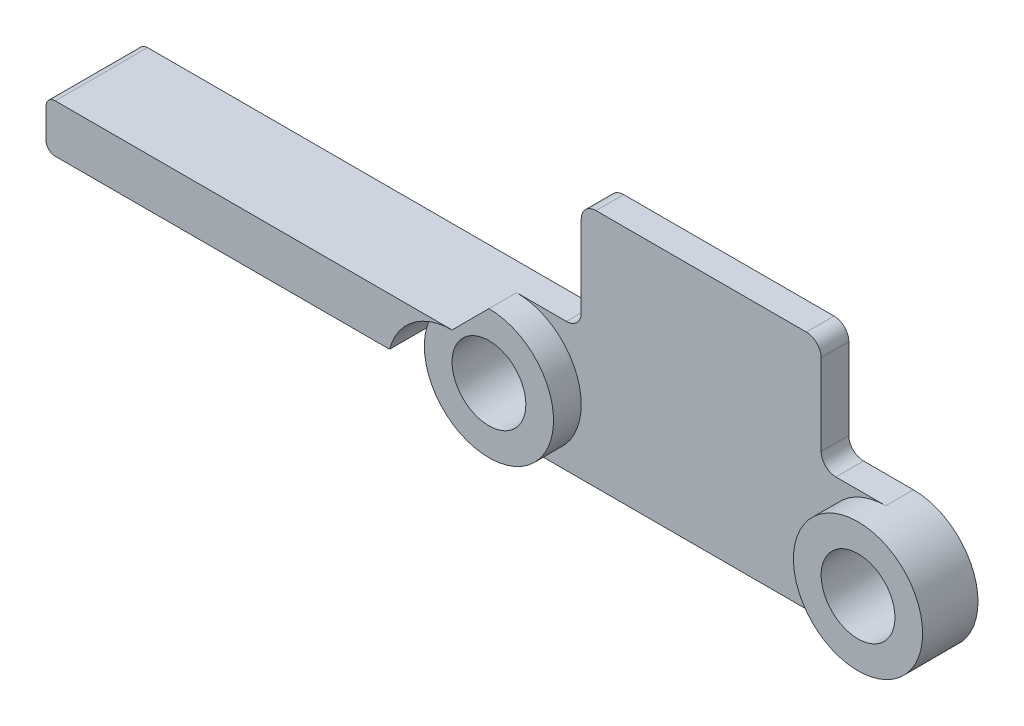
ISO-10303-21;
HEADER;
FILE_DESCRIPTION(('STEP AP214'),'2;1');
FILE_NAME('part.step','',(''),(''),'','','');
FILE_SCHEMA(('AUTOMOTIVE_DESIGN { 1 0 10303 214 1 1 1 1 }'));
ENDSEC;
DATA;
#1=APPLICATION_CONTEXT('core data for automotive mechanical design processes');
#2=APPLICATION_PROTOCOL_DEFINITION('international standard','automotive_design',2000,#1);
#3=PRODUCT_CONTEXT('',#1,'mechanical');
#4=PRODUCT('Part','Part','',(#3));
#5=PRODUCT_RELATED_PRODUCT_CATEGORY('part','',(#4));
#6=PRODUCT_DEFINITION_FORMATION('','',#4);
#7=PRODUCT_DEFINITION_CONTEXT('part definition',#1,'design');
#8=PRODUCT_DEFINITION('design','',#6,#7);
#9=PRODUCT_DEFINITION_SHAPE('','',#8);
#10=(LENGTH_UNIT() NAMED_UNIT(*) SI_UNIT(.MILLI.,.METRE.));
#11=(NAMED_UNIT(*) PLANE_ANGLE_UNIT() SI_UNIT($,.RADIAN.));
#12=(NAMED_UNIT(*) SI_UNIT($,.STERADIAN.) SOLID_ANGLE_UNIT());
#13=UNCERTAINTY_MEASURE_WITH_UNIT(LENGTH_MEASURE(1.E-05),#10,'distance_accuracy_value','');
#14=(GEOMETRIC_REPRESENTATION_CONTEXT(3) GLOBAL_UNCERTAINTY_ASSIGNED_CONTEXT((#13)) GLOBAL_UNIT_ASSIGNED_CONTEXT((#10,
#11,#12)) REPRESENTATION_CONTEXT('',''));
#15=CARTESIAN_POINT('',(0.,0.,0.));
#16=DIRECTION('',(0.,0.,1.));
#17=DIRECTION('',(1.,0.,0.));
#18=AXIS2_PLACEMENT_3D('',#15,#16,#17);
#19=CARTESIAN_POINT('',(0.,0.,1.5));
#20=DIRECTION('',(0.,0.,1.));
#21=DIRECTION('',(1.,0.,0.));
#22=AXIS2_PLACEMENT_3D('',#19,#20,#21);
#23=PLANE('',#22);
#24=DIRECTION('',(0.,1.,0.));
#25=VECTOR('',#24,1.);
#26=CARTESIAN_POINT('',(16.5,0.,1.5));
#27=LINE('',#26,#25);
#28=CARTESIAN_POINT('',(16.5,4.3,1.5));
#29=VERTEX_POINT('',#28);
#30=CARTESIAN_POINT('',(16.5,8.7,1.5));
#31=VERTEX_POINT('',#30);
#32=EDGE_CURVE('E175',#29,#31,#27,.T.);
#33=ORIENTED_EDGE('',*,*,#32,.T.);
#34=CARTESIAN_POINT('',(15.7,8.7,1.5));
#35=DIRECTION('',(0.,0.,1.));
#36=DIRECTION('',(1.,0.,0.));
#37=AXIS2_PLACEMENT_3D('',#34,#35,#36);
#38=CIRCLE('',#37,0.8);
#39=CARTESIAN_POINT('',(15.7,9.5,1.5));
#40=VERTEX_POINT('',#39);
#41=EDGE_CURVE('E289',#31,#40,#38,.T.);
#42=ORIENTED_EDGE('',*,*,#41,.T.);
#43=DIRECTION('',(1.,0.,0.));
#44=VECTOR('',#43,1.);
#45=CARTESIAN_POINT('',(0.,9.5,1.5));
#46=LINE('',#45,#44);
#47=CARTESIAN_POINT('',(4.3,9.5,1.5));
#48=VERTEX_POINT('',#47);
#49=EDGE_CURVE('E237',#48,#40,#46,.T.);
#50=ORIENTED_EDGE('',*,*,#49,.F.);
#51=CARTESIAN_POINT('',(4.3,8.7,1.5));
#52=DIRECTION('',(0.,0.,1.));
#53=DIRECTION('',(1.,0.,0.));
#54=AXIS2_PLACEMENT_3D('',#51,#52,#53);
#55=CIRCLE('',#54,0.8);
#56=CARTESIAN_POINT('',(3.5,8.7,1.5));
#57=VERTEX_POINT('',#56);
#58=EDGE_CURVE('E287',#48,#57,#55,.T.);
#59=ORIENTED_EDGE('',*,*,#58,.T.);
#60=DIRECTION('',(0.,1.,0.));
#61=VECTOR('',#60,1.);
#62=CARTESIAN_POINT('',(3.5,0.,1.5));
#63=LINE('',#62,#61);
#64=CARTESIAN_POINT('',(3.5,4.3,1.5));
#65=VERTEX_POINT('',#64);
#66=EDGE_CURVE('E240',#65,#57,#63,.T.);
#67=ORIENTED_EDGE('',*,*,#66,.F.);
#68=CARTESIAN_POINT('',(2.7,4.3,1.5));
#69=DIRECTION('',(0.,0.,1.));
#70=DIRECTION('',(1.,0.,0.));
#71=AXIS2_PLACEMENT_3D('',#68,#69,#70);
#72=CIRCLE('',#71,0.8);
#73=CARTESIAN_POINT('',(2.7,3.5,1.5));
#74=VERTEX_POINT('',#73);
#75=EDGE_CURVE('E306',#65,#74,#72,.F.);
#76=ORIENTED_EDGE('',*,*,#75,.T.);
#77=DIRECTION('',(1.,0.,0.));
#78=VECTOR('',#77,1.);
#79=CARTESIAN_POINT('',(0.,3.5,1.5));
#80=LINE('',#79,#78);
#81=CARTESIAN_POINT('',(0.,3.5,1.5));
#82=VERTEX_POINT('',#81);
#83=EDGE_CURVE('E243',#82,#74,#80,.T.);
#84=ORIENTED_EDGE('',*,*,#83,.F.);
#85=CARTESIAN_POINT('',(0.,0.,1.5));
#86=DIRECTION('',(0.,0.,1.));
#87=DIRECTION('',(1.,0.,0.));
#88=AXIS2_PLACEMENT_3D('',#85,#86,#87);
#89=CIRCLE('',#88,3.5);
#90=CARTESIAN_POINT('',(0.,-3.5,1.5));
#91=VERTEX_POINT('',#90);
#92=EDGE_CURVE('E203',#91,#82,#89,.T.);
#93=ORIENTED_EDGE('',*,*,#92,.F.);
#94=DIRECTION('',(1.,0.,0.));
#95=VECTOR('',#94,1.);
#96=CARTESIAN_POINT('',(0.,-3.5,1.5));
#97=LINE('',#96,#95);
#98=CARTESIAN_POINT('',(20.,-3.5,1.5));
#99=VERTEX_POINT('',#98);
#100=EDGE_CURVE('E187',#91,#99,#97,.T.);
#101=ORIENTED_EDGE('',*,*,#100,.T.);
#102=CARTESIAN_POINT('',(20.,0.,1.5));
#103=DIRECTION('',(0.,0.,1.));
#104=DIRECTION('',(1.,0.,0.));
#105=AXIS2_PLACEMENT_3D('',#102,#103,#104);
#106=CIRCLE('',#105,3.5);
#107=CARTESIAN_POINT('',(20.,3.5,1.5));
#108=VERTEX_POINT('',#107);
#109=EDGE_CURVE('E183',#108,#99,#106,.T.);
#110=ORIENTED_EDGE('',*,*,#109,.F.);
#111=DIRECTION('',(1.,0.,0.));
#112=VECTOR('',#111,1.);
#113=CARTESIAN_POINT('',(0.,3.5,1.5));
#114=LINE('',#113,#112);
#115=CARTESIAN_POINT('',(17.3,3.5,1.5));
#116=VERTEX_POINT('',#115);
#117=EDGE_CURVE('E164',#116,#108,#114,.T.);
#118=ORIENTED_EDGE('',*,*,#117,.F.);
#119=CARTESIAN_POINT('',(17.3,4.3,1.5));
#120=DIRECTION('',(0.,0.,1.));
#121=DIRECTION('',(1.,0.,0.));
#122=AXIS2_PLACEMENT_3D('',#119,#120,#121);
#123=CIRCLE('',#122,0.8);
#124=EDGE_CURVE('E302',#116,#29,#123,.F.);
#125=ORIENTED_EDGE('',*,*,#124,.T.);
#126=EDGE_LOOP('',(#33,#42,#50,#59,#67,#76,#84,#93,#101,#110,#118,#125));
#127=FACE_BOUND('',#126,.T.);
#128=ADVANCED_FACE('F35',(#127),#23,.T.);
#129=CARTESIAN_POINT('',(0.,3.5,1.5));
#130=DIRECTION('',(0.,1.,0.));
#131=DIRECTION('',(0.,0.,1.));
#132=AXIS2_PLACEMENT_3D('',#129,#130,#131);
#133=PLANE('',#132);
#134=DIRECTION('',(1.,0.,0.));
#135=VECTOR('',#134,1.);
#136=CARTESIAN_POINT('',(0.,3.5,0.));
#137=LINE('',#136,#135);
#138=CARTESIAN_POINT('',(17.3,3.5,0.));
#139=VERTEX_POINT('',#138);
#140=CARTESIAN_POINT('',(20.,3.5,0.));
#141=VERTEX_POINT('',#140);
#142=EDGE_CURVE('E234',#139,#141,#137,.T.);
#143=ORIENTED_EDGE('',*,*,#142,.F.);
#144=DIRECTION('',(0.,0.,-1.));
#145=VECTOR('',#144,1.);
#146=CARTESIAN_POINT('',(17.3,3.5,1.5));
#147=LINE('',#146,#145);
#148=EDGE_CURVE('E171',#139,#116,#147,.F.);
#149=ORIENTED_EDGE('',*,*,#148,.T.);
#150=ORIENTED_EDGE('',*,*,#117,.T.);
#151=DIRECTION('',(0.,0.,-1.));
#152=VECTOR('',#151,1.);
#153=CARTESIAN_POINT('',(20.,3.5,1.5));
#154=LINE('',#153,#152);
#155=EDGE_CURVE('E168',#108,#141,#154,.T.);
#156=ORIENTED_EDGE('',*,*,#155,.T.);
#157=EDGE_LOOP('',(#143,#149,#150,#156));
#158=FACE_BOUND('',#157,.T.);
#159=ADVANCED_FACE('F167',(#158),#133,.T.);
#160=CARTESIAN_POINT('',(16.5,0.,1.5));
#161=DIRECTION('',(-1.,0.,0.));
#162=DIRECTION('',(0.,0.,1.));
#163=AXIS2_PLACEMENT_3D('',#160,#161,#162);
#164=PLANE('',#163);
#165=DIRECTION('',(0.,1.,0.));
#166=VECTOR('',#165,1.);
#167=CARTESIAN_POINT('',(16.5,0.,0.));
#168=LINE('',#167,#166);
#169=CARTESIAN_POINT('',(16.5,4.3,0.));
#170=VERTEX_POINT('',#169);
#171=CARTESIAN_POINT('',(16.5,8.7,0.));
#172=VERTEX_POINT('',#171);
#173=EDGE_CURVE('E248',#170,#172,#168,.T.);
#174=ORIENTED_EDGE('',*,*,#173,.T.);
#175=DIRECTION('',(0.,0.,-1.));
#176=VECTOR('',#175,1.);
#177=CARTESIAN_POINT('',(16.5,8.7,1.5));
#178=LINE('',#177,#176);
#179=EDGE_CURVE('E285',#172,#31,#178,.F.);
#180=ORIENTED_EDGE('',*,*,#179,.T.);
#181=ORIENTED_EDGE('',*,*,#32,.F.);
#182=DIRECTION('',(0.,0.,-1.));
#183=VECTOR('',#182,1.);
#184=CARTESIAN_POINT('',(16.5,4.3,1.5));
#185=LINE('',#184,#183);
#186=EDGE_CURVE('E282',#29,#170,#185,.T.);
#187=ORIENTED_EDGE('',*,*,#186,.T.);
#188=EDGE_LOOP('',(#174,#180,#181,#187));
#189=FACE_BOUND('',#188,.T.);
#190=ADVANCED_FACE('F359',(#189),#164,.F.);
#191=CARTESIAN_POINT('',(0.,9.5,1.5));
#192=DIRECTION('',(0.,1.,0.));
#193=DIRECTION('',(0.,0.,1.));
#194=AXIS2_PLACEMENT_3D('',#191,#192,#193);
#195=PLANE('',#194);
#196=ORIENTED_EDGE('',*,*,#49,.T.);
#197=DIRECTION('',(0.,0.,-1.));
#198=VECTOR('',#197,1.);
#199=CARTESIAN_POINT('',(15.7,9.5,0.));
#200=LINE('',#199,#198);
#201=CARTESIAN_POINT('',(15.7,9.5,0.));
#202=VERTEX_POINT('',#201);
#203=EDGE_CURVE('E275',#40,#202,#200,.T.);
#204=ORIENTED_EDGE('',*,*,#203,.T.);
#205=DIRECTION('',(1.,0.,0.));
#206=VECTOR('',#205,1.);
#207=CARTESIAN_POINT('',(0.,9.5,0.));
#208=LINE('',#207,#206);
#209=CARTESIAN_POINT('',(4.3,9.5,0.));
#210=VERTEX_POINT('',#209);
#211=EDGE_CURVE('E251',#210,#202,#208,.T.);
#212=ORIENTED_EDGE('',*,*,#211,.F.);
#213=DIRECTION('',(0.,0.,-1.));
#214=VECTOR('',#213,1.);
#215=CARTESIAN_POINT('',(4.3,9.5,1.5));
#216=LINE('',#215,#214);
#217=EDGE_CURVE('E273',#210,#48,#216,.F.);
#218=ORIENTED_EDGE('',*,*,#217,.T.);
#219=EDGE_LOOP('',(#196,#204,#212,#218));
#220=FACE_BOUND('',#219,.T.);
#221=ADVANCED_FACE('F350',(#220),#195,.T.);
#222=CARTESIAN_POINT('',(3.5,0.,1.5));
#223=DIRECTION('',(-1.,0.,0.));
#224=DIRECTION('',(0.,-1.,0.));
#225=AXIS2_PLACEMENT_3D('',#222,#223,#224);
#226=PLANE('',#225);
#227=ORIENTED_EDGE('',*,*,#66,.T.);
#228=DIRECTION('',(0.,0.,-1.));
#229=VECTOR('',#228,1.);
#230=CARTESIAN_POINT('',(3.5,8.7,1.5));
#231=LINE('',#230,#229);
#232=CARTESIAN_POINT('',(3.5,8.7,0.));
#233=VERTEX_POINT('',#232);
#234=EDGE_CURVE('E294',#57,#233,#231,.T.);
#235=ORIENTED_EDGE('',*,*,#234,.T.);
#236=DIRECTION('',(0.,1.,0.));
#237=VECTOR('',#236,1.);
#238=CARTESIAN_POINT('',(3.5,0.,0.));
#239=LINE('',#238,#237);
#240=CARTESIAN_POINT('',(3.5,4.3,0.));
#241=VERTEX_POINT('',#240);
#242=EDGE_CURVE('E254',#241,#233,#239,.T.);
#243=ORIENTED_EDGE('',*,*,#242,.F.);
#244=DIRECTION('',(0.,0.,-1.));
#245=VECTOR('',#244,1.);
#246=CARTESIAN_POINT('',(3.5,4.3,1.5));
#247=LINE('',#246,#245);
#248=EDGE_CURVE('E292',#241,#65,#247,.F.);
#249=ORIENTED_EDGE('',*,*,#248,.T.);
#250=EDGE_LOOP('',(#227,#235,#243,#249));
#251=FACE_BOUND('',#250,.T.);
#252=ADVANCED_FACE('F341',(#251),#226,.T.);
#253=CARTESIAN_POINT('',(0.,3.5,1.5));
#254=DIRECTION('',(0.,1.,0.));
#255=DIRECTION('',(0.,0.,1.));
#256=AXIS2_PLACEMENT_3D('',#253,#254,#255);
#257=PLANE('',#256);
#258=DIRECTION('',(1.,0.,0.));
#259=VECTOR('',#258,1.);
#260=CARTESIAN_POINT('',(0.,3.5,0.));
#261=LINE('',#260,#259);
#262=CARTESIAN_POINT('',(-21.5,3.5,0.));
#263=VERTEX_POINT('',#262);
#264=CARTESIAN_POINT('',(2.7,3.5,0.));
#265=VERTEX_POINT('',#264);
#266=EDGE_CURVE('E257',#263,#265,#261,.T.);
#267=ORIENTED_EDGE('',*,*,#266,.F.);
#268=DIRECTION('',(0.,0.,-1.));
#269=VECTOR('',#268,1.);
#270=CARTESIAN_POINT('',(-21.5,3.5,1.5));
#271=LINE('',#270,#269);
#272=CARTESIAN_POINT('',(-21.5,3.5,5.));
#273=VERTEX_POINT('',#272);
#274=EDGE_CURVE('E58',#263,#273,#271,.F.);
#275=ORIENTED_EDGE('',*,*,#274,.T.);
#276=DIRECTION('',(-1.,0.,0.));
#277=VECTOR('',#276,1.);
#278=CARTESIAN_POINT('',(0.,3.5,5.));
#279=LINE('',#278,#277);
#280=CARTESIAN_POINT('',(0.,3.5,5.));
#281=VERTEX_POINT('',#280);
#282=EDGE_CURVE('E216',#281,#273,#279,.T.);
#283=ORIENTED_EDGE('',*,*,#282,.F.);
#284=DIRECTION('',(0.,0.,-1.));
#285=VECTOR('',#284,1.);
#286=CARTESIAN_POINT('',(0.,3.5,5.));
#287=LINE('',#286,#285);
#288=CARTESIAN_POINT('',(0.,3.5,3.));
#289=VERTEX_POINT('',#288);
#290=EDGE_CURVE('E232',#281,#289,#287,.T.);
#291=ORIENTED_EDGE('',*,*,#290,.T.);
#292=DIRECTION('',(0.,0.,-1.));
#293=VECTOR('',#292,1.);
#294=CARTESIAN_POINT('',(0.,3.5,3.));
#295=LINE('',#294,#293);
#296=EDGE_CURVE('E207',#82,#289,#295,.F.);
#297=ORIENTED_EDGE('',*,*,#296,.F.);
#298=ORIENTED_EDGE('',*,*,#83,.T.);
#299=DIRECTION('',(0.,0.,-1.));
#300=VECTOR('',#299,1.);
#301=CARTESIAN_POINT('',(2.7,3.5,0.));
#302=LINE('',#301,#300);
#303=EDGE_CURVE('E297',#74,#265,#302,.T.);
#304=ORIENTED_EDGE('',*,*,#303,.T.);
#305=EDGE_LOOP('',(#267,#275,#283,#291,#297,#298,#304));
#306=FACE_BOUND('',#305,.T.);
#307=ADVANCED_FACE('F332',(#306),#257,.T.);
#308=CARTESIAN_POINT('',(0.,0.,1.5));
#309=DIRECTION('',(0.,0.,-1.));
#310=DIRECTION('',(-1.,0.,0.));
#311=AXIS2_PLACEMENT_3D('',#308,#309,#310);
#312=CYLINDRICAL_SURFACE('',#311,3.5);
#313=DIRECTION('',(0.,0.,-1.));
#314=VECTOR('',#313,1.);
#315=CARTESIAN_POINT('',(0.,-3.5,1.5));
#316=LINE('',#315,#314);
#317=CARTESIAN_POINT('',(0.,-3.5,0.));
#318=VERTEX_POINT('',#317);
#319=EDGE_CURVE('E270',#91,#318,#316,.T.);
#320=ORIENTED_EDGE('',*,*,#319,.F.);
#321=ORIENTED_EDGE('',*,*,#92,.T.);
#322=ORIENTED_EDGE('',*,*,#296,.T.);
#323=CARTESIAN_POINT('',(0.,0.,3.));
#324=DIRECTION('',(0.,0.,1.));
#325=DIRECTION('',(1.,0.,0.));
#326=AXIS2_PLACEMENT_3D('',#323,#324,#325);
#327=CIRCLE('',#326,3.5);
#328=CARTESIAN_POINT('',(-3.38277696123464,0.8982316129708,3.));
#329=VERTEX_POINT('',#328);
#330=EDGE_CURVE('E202',#329,#289,#327,.T.);
#331=ORIENTED_EDGE('',*,*,#330,.F.);
#332=DIRECTION('',(0.,0.,-1.));
#333=VECTOR('',#332,1.);
#334=CARTESIAN_POINT('',(-3.38277696123464,0.8982316129708,5.));
#335=LINE('',#334,#333);
#336=CARTESIAN_POINT('',(-3.38277696123464,0.8982316129708,0.));
#337=VERTEX_POINT('',#336);
#338=EDGE_CURVE('E224',#329,#337,#335,.T.);
#339=ORIENTED_EDGE('',*,*,#338,.T.);
#340=CARTESIAN_POINT('',(0.,0.,0.));
#341=DIRECTION('',(0.,0.,1.));
#342=DIRECTION('',(1.,0.,0.));
#343=AXIS2_PLACEMENT_3D('',#340,#341,#342);
#344=CIRCLE('',#343,3.5);
#345=EDGE_CURVE('E259',#337,#318,#344,.T.);
#346=ORIENTED_EDGE('',*,*,#345,.T.);
#347=EDGE_LOOP('',(#320,#321,#322,#331,#339,#346));
#348=FACE_BOUND('',#347,.T.);
#349=ADVANCED_FACE('F370',(#348),#312,.T.);
#350=CARTESIAN_POINT('',(0.,-3.5,1.5));
#351=DIRECTION('',(0.,1.,0.));
#352=DIRECTION('',(0.,0.,1.));
#353=AXIS2_PLACEMENT_3D('',#350,#351,#352);
#354=PLANE('',#353);
#355=DIRECTION('',(1.,0.,0.));
#356=VECTOR('',#355,1.);
#357=CARTESIAN_POINT('',(0.,-3.5,0.));
#358=LINE('',#357,#356);
#359=CARTESIAN_POINT('',(20.,-3.5,0.));
#360=VERTEX_POINT('',#359);
#361=EDGE_CURVE('E261',#318,#360,#358,.T.);
#362=ORIENTED_EDGE('',*,*,#361,.T.);
#363=DIRECTION('',(0.,0.,-1.));
#364=VECTOR('',#363,1.);
#365=CARTESIAN_POINT('',(20.,-3.5,1.5));
#366=LINE('',#365,#364);
#367=EDGE_CURVE('E186',#99,#360,#366,.T.);
#368=ORIENTED_EDGE('',*,*,#367,.F.);
#369=ORIENTED_EDGE('',*,*,#100,.F.);
#370=ORIENTED_EDGE('',*,*,#319,.T.);
#371=EDGE_LOOP('',(#362,#368,#369,#370));
#372=FACE_BOUND('',#371,.T.);
#373=ADVANCED_FACE('F367',(#372),#354,.F.);
#374=CARTESIAN_POINT('',(0.,0.,1.5));
#375=DIRECTION('',(0.,0.,-1.));
#376=DIRECTION('',(-1.,0.,0.));
#377=AXIS2_PLACEMENT_3D('',#374,#375,#376);
#378=CYLINDRICAL_SURFACE('',#377,2.);
#379=CARTESIAN_POINT('',(0.,0.,0.));
#380=DIRECTION('',(0.,0.,1.));
#381=DIRECTION('',(1.,0.,0.));
#382=AXIS2_PLACEMENT_3D('',#379,#380,#381);
#383=CIRCLE('',#382,2.);
#384=CARTESIAN_POINT('',(2.,0.,0.));
#385=VERTEX_POINT('',#384);
#386=EDGE_CURVE('E264',#385,#385,#383,.T.);
#387=ORIENTED_EDGE('',*,*,#386,.F.);
#388=EDGE_LOOP('',(#387));
#389=FACE_BOUND('',#388,.T.);
#390=CARTESIAN_POINT('',(0.,0.,3.));
#391=DIRECTION('',(0.,0.,1.));
#392=DIRECTION('',(1.,0.,0.));
#393=AXIS2_PLACEMENT_3D('',#390,#391,#392);
#394=CIRCLE('',#393,2.);
#395=CARTESIAN_POINT('',(2.,0.,3.));
#396=VERTEX_POINT('',#395);
#397=EDGE_CURVE('E199',#396,#396,#394,.F.);
#398=ORIENTED_EDGE('',*,*,#397,.F.);
#399=EDGE_LOOP('',(#398));
#400=FACE_BOUND('',#399,.T.);
#401=ADVANCED_FACE('F398',(#389,#400),#378,.F.);
#402=CARTESIAN_POINT('',(20.,0.,1.5));
#403=DIRECTION('',(0.,0.,-1.));
#404=DIRECTION('',(-1.,0.,0.));
#405=AXIS2_PLACEMENT_3D('',#402,#403,#404);
#406=CYLINDRICAL_SURFACE('',#405,3.5);
#407=CARTESIAN_POINT('',(20.,0.,0.));
#408=DIRECTION('',(0.,0.,1.));
#409=DIRECTION('',(1.,0.,0.));
#410=AXIS2_PLACEMENT_3D('',#407,#408,#409);
#411=CIRCLE('',#410,3.5);
#412=EDGE_CURVE('E185',#360,#141,#411,.T.);
#413=ORIENTED_EDGE('',*,*,#412,.T.);
#414=ORIENTED_EDGE('',*,*,#155,.F.);
#415=ORIENTED_EDGE('',*,*,#109,.T.);
#416=ORIENTED_EDGE('',*,*,#367,.T.);
#417=EDGE_LOOP('',(#413,#414,#415,#416));
#418=FACE_BOUND('',#417,.T.);
#419=CARTESIAN_POINT('',(20.,0.,3.));
#420=DIRECTION('',(0.,0.,1.));
#421=DIRECTION('',(1.,0.,0.));
#422=AXIS2_PLACEMENT_3D('',#419,#420,#421);
#423=CIRCLE('',#422,3.5);
#424=CARTESIAN_POINT('',(23.5,0.,3.));
#425=VERTEX_POINT('',#424);
#426=EDGE_CURVE('E195',#425,#425,#423,.T.);
#427=ORIENTED_EDGE('',*,*,#426,.F.);
#428=EDGE_LOOP('',(#427));
#429=FACE_BOUND('',#428,.T.);
#430=ADVANCED_FACE('F180',(#418,#429),#406,.T.);
#431=CARTESIAN_POINT('',(20.,0.,1.5));
#432=DIRECTION('',(0.,0.,-1.));
#433=DIRECTION('',(-1.,0.,0.));
#434=AXIS2_PLACEMENT_3D('',#431,#432,#433);
#435=CYLINDRICAL_SURFACE('',#434,2.);
#436=CARTESIAN_POINT('',(20.,0.,0.));
#437=DIRECTION('',(0.,0.,1.));
#438=DIRECTION('',(1.,0.,0.));
#439=AXIS2_PLACEMENT_3D('',#436,#437,#438);
#440=CIRCLE('',#439,2.);
#441=CARTESIAN_POINT('',(22.,0.,0.));
#442=VERTEX_POINT('',#441);
#443=EDGE_CURVE('E176',#442,#442,#440,.T.);
#444=ORIENTED_EDGE('',*,*,#443,.F.);
#445=EDGE_LOOP('',(#444));
#446=FACE_BOUND('',#445,.T.);
#447=CARTESIAN_POINT('',(20.,0.,3.));
#448=DIRECTION('',(0.,0.,1.));
#449=DIRECTION('',(1.,0.,0.));
#450=AXIS2_PLACEMENT_3D('',#447,#448,#449);
#451=CIRCLE('',#450,2.);
#452=CARTESIAN_POINT('',(22.,0.,3.));
#453=VERTEX_POINT('',#452);
#454=EDGE_CURVE('E192',#453,#453,#451,.F.);
#455=ORIENTED_EDGE('',*,*,#454,.F.);
#456=EDGE_LOOP('',(#455));
#457=FACE_BOUND('',#456,.T.);
#458=ADVANCED_FACE('F394',(#446,#457),#435,.F.);
#459=CARTESIAN_POINT('',(0.,0.,0.));
#460=DIRECTION('',(0.,0.,1.));
#461=DIRECTION('',(1.,0.,0.));
#462=AXIS2_PLACEMENT_3D('',#459,#460,#461);
#463=PLANE('',#462);
#464=DIRECTION('',(0.,1.,0.));
#465=VECTOR('',#464,1.);
#466=CARTESIAN_POINT('',(-22.,0.,0.));
#467=LINE('',#466,#465);
#468=CARTESIAN_POINT('',(-22.,1.3982316129708,0.));
#469=VERTEX_POINT('',#468);
#470=CARTESIAN_POINT('',(-22.,3.,0.));
#471=VERTEX_POINT('',#470);
#472=EDGE_CURVE('E212',#469,#471,#467,.T.);
#473=ORIENTED_EDGE('',*,*,#472,.T.);
#474=CARTESIAN_POINT('',(-21.5,3.,0.));
#475=DIRECTION('',(0.,0.,1.));
#476=DIRECTION('',(1.,0.,0.));
#477=AXIS2_PLACEMENT_3D('',#474,#475,#476);
#478=CIRCLE('',#477,0.5);
#479=EDGE_CURVE('E315',#471,#263,#478,.F.);
#480=ORIENTED_EDGE('',*,*,#479,.T.);
#481=ORIENTED_EDGE('',*,*,#266,.T.);
#482=CARTESIAN_POINT('',(2.7,4.3,0.));
#483=DIRECTION('',(0.,0.,1.));
#484=DIRECTION('',(1.,0.,0.));
#485=AXIS2_PLACEMENT_3D('',#482,#483,#484);
#486=CIRCLE('',#485,0.8);
#487=EDGE_CURVE('E304',#265,#241,#486,.T.);
#488=ORIENTED_EDGE('',*,*,#487,.T.);
#489=ORIENTED_EDGE('',*,*,#242,.T.);
#490=CARTESIAN_POINT('',(4.3,8.7,0.));
#491=DIRECTION('',(0.,0.,1.));
#492=DIRECTION('',(1.,0.,0.));
#493=AXIS2_PLACEMENT_3D('',#490,#491,#492);
#494=CIRCLE('',#493,0.8);
#495=EDGE_CURVE('E278',#233,#210,#494,.F.);
#496=ORIENTED_EDGE('',*,*,#495,.T.);
#497=ORIENTED_EDGE('',*,*,#211,.T.);
#498=CARTESIAN_POINT('',(15.7,8.7,0.));
#499=DIRECTION('',(0.,0.,1.));
#500=DIRECTION('',(1.,0.,0.));
#501=AXIS2_PLACEMENT_3D('',#498,#499,#500);
#502=CIRCLE('',#501,0.8);
#503=EDGE_CURVE('E280',#202,#172,#502,.F.);
#504=ORIENTED_EDGE('',*,*,#503,.T.);
#505=ORIENTED_EDGE('',*,*,#173,.F.);
#506=CARTESIAN_POINT('',(17.3,4.3,0.));
#507=DIRECTION('',(0.,0.,1.));
#508=DIRECTION('',(1.,0.,0.));
#509=AXIS2_PLACEMENT_3D('',#506,#507,#508);
#510=CIRCLE('',#509,0.8);
#511=EDGE_CURVE('E300',#170,#139,#510,.T.);
#512=ORIENTED_EDGE('',*,*,#511,.T.);
#513=ORIENTED_EDGE('',*,*,#142,.T.);
#514=ORIENTED_EDGE('',*,*,#412,.F.);
#515=ORIENTED_EDGE('',*,*,#361,.F.);
#516=ORIENTED_EDGE('',*,*,#345,.F.);
#517=DIRECTION('',(-1.,0.,0.));
#518=VECTOR('',#517,1.);
#519=CARTESIAN_POINT('',(0.,0.8982316129708,0.));
#520=LINE('',#519,#518);
#521=CARTESIAN_POINT('',(-21.5,0.898231612970797,0.));
#522=VERTEX_POINT('',#521);
#523=EDGE_CURVE('E217',#337,#522,#520,.T.);
#524=ORIENTED_EDGE('',*,*,#523,.T.);
#525=CARTESIAN_POINT('',(-21.5,1.3982316129708,0.));
#526=DIRECTION('',(0.,0.,1.));
#527=DIRECTION('',(1.,0.,0.));
#528=AXIS2_PLACEMENT_3D('',#525,#526,#527);
#529=CIRCLE('',#528,0.5);
#530=EDGE_CURVE('E313',#522,#469,#529,.F.);
#531=ORIENTED_EDGE('',*,*,#530,.T.);
#532=EDGE_LOOP('',(#473,#480,#481,#488,#489,#496,#497,#504,#505,#512,#513,#514,#515,#516,#524,#531));
#533=FACE_BOUND('',#532,.T.);
#534=ORIENTED_EDGE('',*,*,#386,.T.);
#535=EDGE_LOOP('',(#534));
#536=FACE_BOUND('',#535,.T.);
#537=ORIENTED_EDGE('',*,*,#443,.T.);
#538=EDGE_LOOP('',(#537));
#539=FACE_BOUND('',#538,.T.);
#540=ADVANCED_FACE('F329',(#533,#536,#539),#463,.F.);
#541=CARTESIAN_POINT('',(0.,0.,5.));
#542=DIRECTION('',(0.,0.,-1.));
#543=DIRECTION('',(-1.,0.,0.));
#544=AXIS2_PLACEMENT_3D('',#541,#542,#543);
#545=CYLINDRICAL_SURFACE('',#544,3.5);
#546=EDGE_CURVE('E204',#289,#329,#327,.T.);
#547=ORIENTED_EDGE('',*,*,#546,.F.);
#548=ORIENTED_EDGE('',*,*,#290,.F.);
#549=CARTESIAN_POINT('',(0.,0.,5.));
#550=DIRECTION('',(0.,0.,1.));
#551=DIRECTION('',(1.,0.,0.));
#552=AXIS2_PLACEMENT_3D('',#549,#550,#551);
#553=CIRCLE('',#552,3.5);
#554=CARTESIAN_POINT('',(-3.38277696123464,0.8982316129708,5.));
#555=VERTEX_POINT('',#554);
#556=EDGE_CURVE('E213',#281,#555,#553,.T.);
#557=ORIENTED_EDGE('',*,*,#556,.T.);
#558=EDGE_CURVE('E229',#555,#329,#335,.T.);
#559=ORIENTED_EDGE('',*,*,#558,.T.);
#560=EDGE_LOOP('',(#547,#548,#557,#559));
#561=FACE_BOUND('',#560,.T.);
#562=ADVANCED_FACE('F390',(#561),#545,.F.);
#563=CARTESIAN_POINT('',(-22.,0.,5.));
#564=DIRECTION('',(-1.,0.,0.));
#565=DIRECTION('',(0.,0.,1.));
#566=AXIS2_PLACEMENT_3D('',#563,#564,#565);
#567=PLANE('',#566);
#568=DIRECTION('',(0.,1.,0.));
#569=VECTOR('',#568,1.);
#570=CARTESIAN_POINT('',(-22.,0.,5.));
#571=LINE('',#570,#569);
#572=CARTESIAN_POINT('',(-22.,1.3982316129708,5.));
#573=VERTEX_POINT('',#572);
#574=CARTESIAN_POINT('',(-22.,3.,5.));
#575=VERTEX_POINT('',#574);
#576=EDGE_CURVE('E219',#573,#575,#571,.T.);
#577=ORIENTED_EDGE('',*,*,#576,.T.);
#578=DIRECTION('',(0.,0.,-1.));
#579=VECTOR('',#578,1.);
#580=CARTESIAN_POINT('',(-22.,3.,5.));
#581=LINE('',#580,#579);
#582=EDGE_CURVE('E310',#575,#471,#581,.T.);
#583=ORIENTED_EDGE('',*,*,#582,.T.);
#584=ORIENTED_EDGE('',*,*,#472,.F.);
#585=DIRECTION('',(0.,0.,-1.));
#586=VECTOR('',#585,1.);
#587=CARTESIAN_POINT('',(-22.,1.3982316129708,5.));
#588=LINE('',#587,#586);
#589=EDGE_CURVE('E308',#469,#573,#588,.F.);
#590=ORIENTED_EDGE('',*,*,#589,.T.);
#591=EDGE_LOOP('',(#577,#583,#584,#590));
#592=FACE_BOUND('',#591,.T.);
#593=ADVANCED_FACE('F324',(#592),#567,.T.);
#594=CARTESIAN_POINT('',(0.,0.8982316129708,5.));
#595=DIRECTION('',(0.,-1.,0.));
#596=DIRECTION('',(1.,0.,0.));
#597=AXIS2_PLACEMENT_3D('',#594,#595,#596);
#598=PLANE('',#597);
#599=DIRECTION('',(-1.,0.,0.));
#600=VECTOR('',#599,1.);
#601=CARTESIAN_POINT('',(0.,0.8982316129708,5.));
#602=LINE('',#601,#600);
#603=CARTESIAN_POINT('',(-21.5,0.898231612970797,5.));
#604=VERTEX_POINT('',#603);
#605=EDGE_CURVE('E222',#555,#604,#602,.T.);
#606=ORIENTED_EDGE('',*,*,#605,.T.);
#607=DIRECTION('',(0.,0.,-1.));
#608=VECTOR('',#607,1.);
#609=CARTESIAN_POINT('',(-21.5,0.898231612970797,5.));
#610=LINE('',#609,#608);
#611=EDGE_CURVE('E11',#604,#522,#610,.T.);
#612=ORIENTED_EDGE('',*,*,#611,.T.);
#613=ORIENTED_EDGE('',*,*,#523,.F.);
#614=ORIENTED_EDGE('',*,*,#338,.F.);
#615=ORIENTED_EDGE('',*,*,#558,.F.);
#616=EDGE_LOOP('',(#606,#612,#613,#614,#615));
#617=FACE_BOUND('',#616,.T.);
#618=ADVANCED_FACE('F375',(#617),#598,.T.);
#619=CARTESIAN_POINT('',(0.,0.,5.));
#620=DIRECTION('',(0.,0.,1.));
#621=DIRECTION('',(1.,0.,0.));
#622=AXIS2_PLACEMENT_3D('',#619,#620,#621);
#623=PLANE('',#622);
#624=ORIENTED_EDGE('',*,*,#282,.T.);
#625=CARTESIAN_POINT('',(-21.5,3.,5.));
#626=DIRECTION('',(0.,0.,1.));
#627=DIRECTION('',(1.,0.,0.));
#628=AXIS2_PLACEMENT_3D('',#625,#626,#627);
#629=CIRCLE('',#628,0.5);
#630=EDGE_CURVE('E43',#273,#575,#629,.T.);
#631=ORIENTED_EDGE('',*,*,#630,.T.);
#632=ORIENTED_EDGE('',*,*,#576,.F.);
#633=CARTESIAN_POINT('',(-21.5,1.3982316129708,5.));
#634=DIRECTION('',(0.,0.,1.));
#635=DIRECTION('',(1.,0.,0.));
#636=AXIS2_PLACEMENT_3D('',#633,#634,#635);
#637=CIRCLE('',#636,0.5);
#638=EDGE_CURVE('E50',#573,#604,#637,.T.);
#639=ORIENTED_EDGE('',*,*,#638,.T.);
#640=ORIENTED_EDGE('',*,*,#605,.F.);
#641=ORIENTED_EDGE('',*,*,#556,.F.);
#642=EDGE_LOOP('',(#624,#631,#632,#639,#640,#641));
#643=FACE_BOUND('',#642,.T.);
#644=ADVANCED_FACE('F319',(#643),#623,.T.);
#645=CARTESIAN_POINT('',(0.,0.,3.));
#646=DIRECTION('',(0.,0.,1.));
#647=DIRECTION('',(1.,0.,0.));
#648=AXIS2_PLACEMENT_3D('',#645,#646,#647);
#649=PLANE('',#648);
#650=ORIENTED_EDGE('',*,*,#397,.T.);
#651=EDGE_LOOP('',(#650));
#652=FACE_BOUND('',#651,.T.);
#653=ORIENTED_EDGE('',*,*,#546,.T.);
#654=ORIENTED_EDGE('',*,*,#330,.T.);
#655=EDGE_LOOP('',(#653,#654));
#656=FACE_BOUND('',#655,.T.);
#657=ADVANCED_FACE('F446',(#652,#656),#649,.T.);
#658=CARTESIAN_POINT('',(0.,0.,3.));
#659=DIRECTION('',(0.,0.,1.));
#660=DIRECTION('',(1.,0.,0.));
#661=AXIS2_PLACEMENT_3D('',#658,#659,#660);
#662=PLANE('',#661);
#663=ORIENTED_EDGE('',*,*,#454,.T.);
#664=EDGE_LOOP('',(#663));
#665=FACE_BOUND('',#664,.T.);
#666=ORIENTED_EDGE('',*,*,#426,.T.);
#667=EDGE_LOOP('',(#666));
#668=FACE_BOUND('',#667,.T.);
#669=ADVANCED_FACE('F418',(#665,#668),#662,.T.);
#670=CARTESIAN_POINT('',(15.7,8.7,1.5));
#671=DIRECTION('',(0.,0.,1.));
#672=DIRECTION('',(1.,0.,0.));
#673=AXIS2_PLACEMENT_3D('',#670,#671,#672);
#674=CYLINDRICAL_SURFACE('',#673,0.8);
#675=ORIENTED_EDGE('',*,*,#41,.F.);
#676=ORIENTED_EDGE('',*,*,#179,.F.);
#677=ORIENTED_EDGE('',*,*,#503,.F.);
#678=ORIENTED_EDGE('',*,*,#203,.F.);
#679=EDGE_LOOP('',(#675,#676,#677,#678));
#680=FACE_BOUND('',#679,.T.);
#681=ADVANCED_FACE('F355',(#680),#674,.T.);
#682=CARTESIAN_POINT('',(17.3,4.3,1.5));
#683=DIRECTION('',(0.,0.,-1.));
#684=DIRECTION('',(-1.,0.,0.));
#685=AXIS2_PLACEMENT_3D('',#682,#683,#684);
#686=CYLINDRICAL_SURFACE('',#685,0.8);
#687=ORIENTED_EDGE('',*,*,#124,.F.);
#688=ORIENTED_EDGE('',*,*,#148,.F.);
#689=ORIENTED_EDGE('',*,*,#511,.F.);
#690=ORIENTED_EDGE('',*,*,#186,.F.);
#691=EDGE_LOOP('',(#687,#688,#689,#690));
#692=FACE_BOUND('',#691,.T.);
#693=ADVANCED_FACE('F363',(#692),#686,.F.);
#694=CARTESIAN_POINT('',(4.3,8.7,1.5));
#695=DIRECTION('',(0.,0.,-1.));
#696=DIRECTION('',(-1.,0.,0.));
#697=AXIS2_PLACEMENT_3D('',#694,#695,#696);
#698=CYLINDRICAL_SURFACE('',#697,0.8);
#699=ORIENTED_EDGE('',*,*,#58,.F.);
#700=ORIENTED_EDGE('',*,*,#217,.F.);
#701=ORIENTED_EDGE('',*,*,#495,.F.);
#702=ORIENTED_EDGE('',*,*,#234,.F.);
#703=EDGE_LOOP('',(#699,#700,#701,#702));
#704=FACE_BOUND('',#703,.T.);
#705=ADVANCED_FACE('F346',(#704),#698,.T.);
#706=CARTESIAN_POINT('',(2.7,4.3,1.5));
#707=DIRECTION('',(0.,0.,1.));
#708=DIRECTION('',(1.,0.,0.));
#709=AXIS2_PLACEMENT_3D('',#706,#707,#708);
#710=CYLINDRICAL_SURFACE('',#709,0.8);
#711=ORIENTED_EDGE('',*,*,#75,.F.);
#712=ORIENTED_EDGE('',*,*,#248,.F.);
#713=ORIENTED_EDGE('',*,*,#487,.F.);
#714=ORIENTED_EDGE('',*,*,#303,.F.);
#715=EDGE_LOOP('',(#711,#712,#713,#714));
#716=FACE_BOUND('',#715,.T.);
#717=ADVANCED_FACE('F337',(#716),#710,.F.);
#718=CARTESIAN_POINT('',(-21.5,3.,5.));
#719=DIRECTION('',(0.,0.,-1.));
#720=DIRECTION('',(-1.,0.,0.));
#721=AXIS2_PLACEMENT_3D('',#718,#719,#720);
#722=CYLINDRICAL_SURFACE('',#721,0.5);
#723=ORIENTED_EDGE('',*,*,#630,.F.);
#724=ORIENTED_EDGE('',*,*,#274,.F.);
#725=ORIENTED_EDGE('',*,*,#479,.F.);
#726=ORIENTED_EDGE('',*,*,#582,.F.);
#727=EDGE_LOOP('',(#723,#724,#725,#726));
#728=FACE_BOUND('',#727,.T.);
#729=ADVANCED_FACE('F327',(#728),#722,.T.);
#730=CARTESIAN_POINT('',(-21.5,1.3982316129708,5.));
#731=DIRECTION('',(0.,0.,-1.));
#732=DIRECTION('',(-1.,0.,0.));
#733=AXIS2_PLACEMENT_3D('',#730,#731,#732);
#734=CYLINDRICAL_SURFACE('',#733,0.5);
#735=ORIENTED_EDGE('',*,*,#638,.F.);
#736=ORIENTED_EDGE('',*,*,#589,.F.);
#737=ORIENTED_EDGE('',*,*,#530,.F.);
#738=ORIENTED_EDGE('',*,*,#611,.F.);
#739=EDGE_LOOP('',(#735,#736,#737,#738));
#740=FACE_BOUND('',#739,.T.);
#741=ADVANCED_FACE('F37',(#740),#734,.T.);
#742=CLOSED_SHELL('',(#128,#159,#190,#221,#252,#307,#349,#373,#401,#430,#458,#540,#562,#593,
#618,#644,#657,#669,#681,#693,#705,#717,#729,#741));
#743=MANIFOLD_SOLID_BREP('B2',#742);
#744=ADVANCED_BREP_SHAPE_REPRESENTATION('',(#18,#743),#14);
#745=SHAPE_DEFINITION_REPRESENTATION(#9,#744);
ENDSEC;
END-ISO-10303-21;
